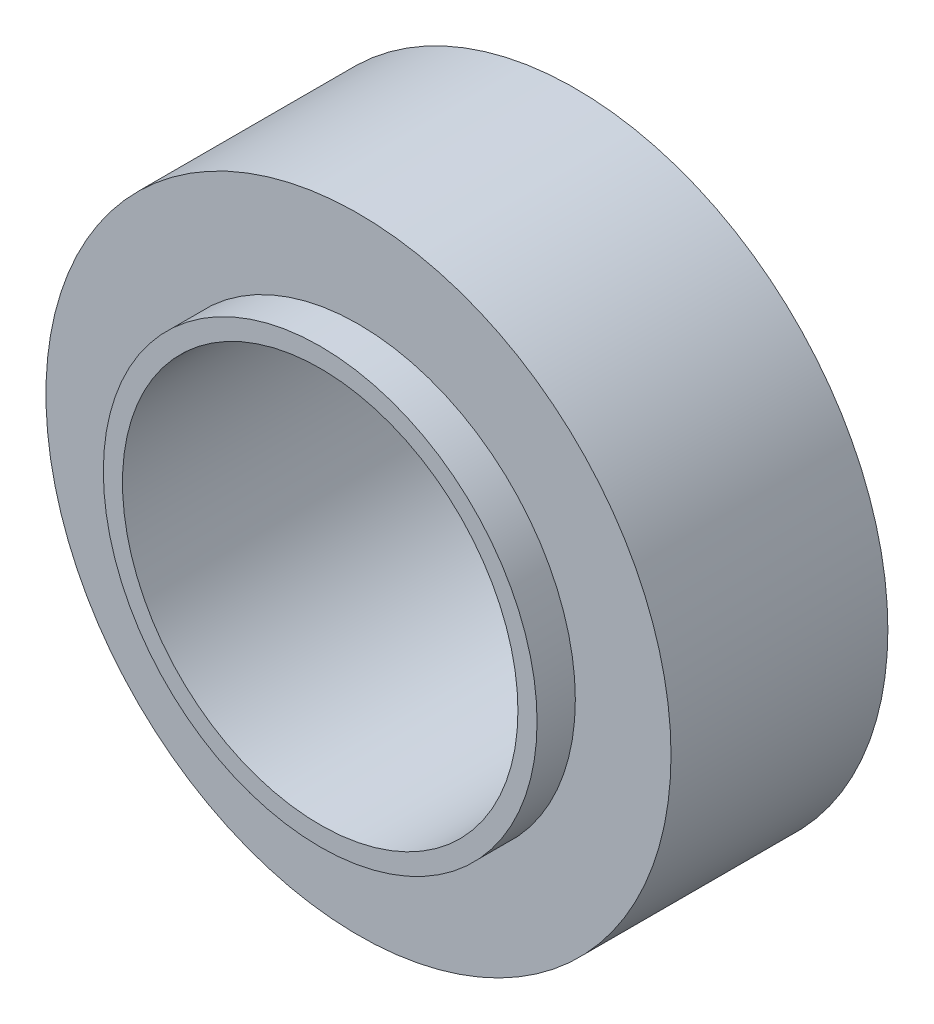
ISO-10303-21;
HEADER;
FILE_DESCRIPTION(('STEP AP214'),'2;1');
FILE_NAME('part.step','',(''),(''),'','','');
FILE_SCHEMA(('AUTOMOTIVE_DESIGN { 1 0 10303 214 1 1 1 1 }'));
ENDSEC;
DATA;
#1=APPLICATION_CONTEXT('core data for automotive mechanical design processes');
#2=APPLICATION_PROTOCOL_DEFINITION('international standard','automotive_design',2000,#1);
#3=PRODUCT_CONTEXT('',#1,'mechanical');
#4=PRODUCT('Part','Part','',(#3));
#5=PRODUCT_RELATED_PRODUCT_CATEGORY('part','',(#4));
#6=PRODUCT_DEFINITION_FORMATION('','',#4);
#7=PRODUCT_DEFINITION_CONTEXT('part definition',#1,'design');
#8=PRODUCT_DEFINITION('design','',#6,#7);
#9=PRODUCT_DEFINITION_SHAPE('','',#8);
#10=(LENGTH_UNIT() NAMED_UNIT(*) SI_UNIT(.MILLI.,.METRE.));
#11=(NAMED_UNIT(*) PLANE_ANGLE_UNIT() SI_UNIT($,.RADIAN.));
#12=(NAMED_UNIT(*) SI_UNIT($,.STERADIAN.) SOLID_ANGLE_UNIT());
#13=UNCERTAINTY_MEASURE_WITH_UNIT(LENGTH_MEASURE(1.E-05),#10,'distance_accuracy_value','');
#14=(GEOMETRIC_REPRESENTATION_CONTEXT(3) GLOBAL_UNCERTAINTY_ASSIGNED_CONTEXT((#13)) GLOBAL_UNIT_ASSIGNED_CONTEXT((#10,
#11,#12)) REPRESENTATION_CONTEXT('',''));
#15=CARTESIAN_POINT('',(0.,0.,0.));
#16=DIRECTION('',(0.,0.,1.));
#17=DIRECTION('',(1.,0.,0.));
#18=AXIS2_PLACEMENT_3D('',#15,#16,#17);
#19=CARTESIAN_POINT('',(0.,0.,23.));
#20=DIRECTION('',(0.,0.,1.));
#21=DIRECTION('',(1.,0.,0.));
#22=AXIS2_PLACEMENT_3D('',#19,#20,#21);
#23=PLANE('',#22);
#24=CARTESIAN_POINT('',(0.,0.,23.));
#25=DIRECTION('',(0.,0.,1.));
#26=DIRECTION('',(1.,0.,0.));
#27=AXIS2_PLACEMENT_3D('',#24,#25,#26);
#28=CIRCLE('',#27,34.);
#29=CARTESIAN_POINT('',(34.,0.,23.));
#30=VERTEX_POINT('',#29);
#31=EDGE_CURVE('E56',#30,#30,#28,.T.);
#32=ORIENTED_EDGE('',*,*,#31,.T.);
#33=EDGE_LOOP('',(#32));
#34=FACE_BOUND('',#33,.T.);
#35=CARTESIAN_POINT('',(0.,0.,23.));
#36=DIRECTION('',(0.,0.,1.));
#37=DIRECTION('',(1.,0.,0.));
#38=AXIS2_PLACEMENT_3D('',#35,#36,#37);
#39=CIRCLE('',#38,31.);
#40=CARTESIAN_POINT('',(31.,0.,23.));
#41=VERTEX_POINT('',#40);
#42=EDGE_CURVE('E10',#41,#41,#39,.T.);
#43=ORIENTED_EDGE('',*,*,#42,.F.);
#44=EDGE_LOOP('',(#43));
#45=FACE_BOUND('',#44,.T.);
#46=ADVANCED_FACE('F29',(#34,#45),#23,.T.);
#47=CARTESIAN_POINT('',(0.,0.,-23.));
#48=DIRECTION('',(0.,0.,1.));
#49=DIRECTION('',(1.,0.,0.));
#50=AXIS2_PLACEMENT_3D('',#47,#48,#49);
#51=PLANE('',#50);
#52=CARTESIAN_POINT('',(0.,0.,-23.));
#53=DIRECTION('',(0.,0.,1.));
#54=DIRECTION('',(1.,0.,0.));
#55=AXIS2_PLACEMENT_3D('',#52,#53,#54);
#56=CIRCLE('',#55,34.);
#57=CARTESIAN_POINT('',(34.,0.,-23.));
#58=VERTEX_POINT('',#57);
#59=EDGE_CURVE('E47',#58,#58,#56,.T.);
#60=ORIENTED_EDGE('',*,*,#59,.F.);
#61=EDGE_LOOP('',(#60));
#62=FACE_BOUND('',#61,.T.);
#63=CARTESIAN_POINT('',(0.,0.,-23.));
#64=DIRECTION('',(0.,0.,1.));
#65=DIRECTION('',(1.,0.,0.));
#66=AXIS2_PLACEMENT_3D('',#63,#64,#65);
#67=CIRCLE('',#66,31.);
#68=CARTESIAN_POINT('',(31.,0.,-23.));
#69=VERTEX_POINT('',#68);
#70=EDGE_CURVE('E33',#69,#69,#67,.T.);
#71=ORIENTED_EDGE('',*,*,#70,.T.);
#72=EDGE_LOOP('',(#71));
#73=FACE_BOUND('',#72,.T.);
#74=ADVANCED_FACE('F78',(#62,#73),#51,.F.);
#75=CARTESIAN_POINT('',(0.,0.,23.));
#76=DIRECTION('',(0.,0.,-1.));
#77=DIRECTION('',(-1.,0.,0.));
#78=AXIS2_PLACEMENT_3D('',#75,#76,#77);
#79=CYLINDRICAL_SURFACE('',#78,49.);
#80=CARTESIAN_POINT('',(0.,0.,17.));
#81=DIRECTION('',(0.,0.,1.));
#82=DIRECTION('',(1.,0.,0.));
#83=AXIS2_PLACEMENT_3D('',#80,#81,#82);
#84=CIRCLE('',#83,49.);
#85=CARTESIAN_POINT('',(49.,0.,17.));
#86=VERTEX_POINT('',#85);
#87=EDGE_CURVE('E50',#86,#86,#84,.T.);
#88=ORIENTED_EDGE('',*,*,#87,.F.);
#89=EDGE_LOOP('',(#88));
#90=FACE_BOUND('',#89,.T.);
#91=CARTESIAN_POINT('',(0.,0.,-17.));
#92=DIRECTION('',(0.,0.,1.));
#93=DIRECTION('',(1.,0.,0.));
#94=AXIS2_PLACEMENT_3D('',#91,#92,#93);
#95=CIRCLE('',#94,49.);
#96=CARTESIAN_POINT('',(49.,0.,-17.));
#97=VERTEX_POINT('',#96);
#98=EDGE_CURVE('E40',#97,#97,#95,.T.);
#99=ORIENTED_EDGE('',*,*,#98,.T.);
#100=EDGE_LOOP('',(#99));
#101=FACE_BOUND('',#100,.T.);
#102=ADVANCED_FACE('F31',(#90,#101),#79,.T.);
#103=CARTESIAN_POINT('',(0.,0.,23.));
#104=DIRECTION('',(0.,0.,-1.));
#105=DIRECTION('',(-1.,0.,0.));
#106=AXIS2_PLACEMENT_3D('',#103,#104,#105);
#107=CYLINDRICAL_SURFACE('',#106,31.);
#108=ORIENTED_EDGE('',*,*,#42,.T.);
#109=EDGE_LOOP('',(#108));
#110=FACE_BOUND('',#109,.T.);
#111=ORIENTED_EDGE('',*,*,#70,.F.);
#112=EDGE_LOOP('',(#111));
#113=FACE_BOUND('',#112,.T.);
#114=ADVANCED_FACE('F77',(#110,#113),#107,.F.);
#115=CARTESIAN_POINT('',(49.,0.,-17.));
#116=DIRECTION('',(0.,0.,1.));
#117=DIRECTION('',(1.,0.,0.));
#118=AXIS2_PLACEMENT_3D('',#115,#116,#117);
#119=PLANE('',#118);
#120=ORIENTED_EDGE('',*,*,#98,.F.);
#121=EDGE_LOOP('',(#120));
#122=FACE_BOUND('',#121,.T.);
#123=CARTESIAN_POINT('',(0.,0.,-17.));
#124=DIRECTION('',(0.,0.,1.));
#125=DIRECTION('',(1.,0.,0.));
#126=AXIS2_PLACEMENT_3D('',#123,#124,#125);
#127=CIRCLE('',#126,34.);
#128=CARTESIAN_POINT('',(34.,0.,-17.));
#129=VERTEX_POINT('',#128);
#130=EDGE_CURVE('E44',#129,#129,#127,.T.);
#131=ORIENTED_EDGE('',*,*,#130,.T.);
#132=EDGE_LOOP('',(#131));
#133=FACE_BOUND('',#132,.T.);
#134=ADVANCED_FACE('F81',(#122,#133),#119,.F.);
#135=CARTESIAN_POINT('',(0.,0.,23.));
#136=DIRECTION('',(0.,0.,1.));
#137=DIRECTION('',(1.,0.,0.));
#138=AXIS2_PLACEMENT_3D('',#135,#136,#137);
#139=CYLINDRICAL_SURFACE('',#138,34.);
#140=ORIENTED_EDGE('',*,*,#130,.F.);
#141=EDGE_LOOP('',(#140));
#142=FACE_BOUND('',#141,.T.);
#143=ORIENTED_EDGE('',*,*,#59,.T.);
#144=EDGE_LOOP('',(#143));
#145=FACE_BOUND('',#144,.T.);
#146=ADVANCED_FACE('F71',(#142,#145),#139,.T.);
#147=CARTESIAN_POINT('',(49.,0.,17.));
#148=DIRECTION('',(0.,0.,-1.));
#149=DIRECTION('',(-1.,0.,0.));
#150=AXIS2_PLACEMENT_3D('',#147,#148,#149);
#151=PLANE('',#150);
#152=CARTESIAN_POINT('',(0.,0.,17.));
#153=DIRECTION('',(0.,0.,1.));
#154=DIRECTION('',(1.,0.,0.));
#155=AXIS2_PLACEMENT_3D('',#152,#153,#154);
#156=CIRCLE('',#155,34.);
#157=CARTESIAN_POINT('',(34.,0.,17.));
#158=VERTEX_POINT('',#157);
#159=EDGE_CURVE('E53',#158,#158,#156,.T.);
#160=ORIENTED_EDGE('',*,*,#159,.F.);
#161=EDGE_LOOP('',(#160));
#162=FACE_BOUND('',#161,.T.);
#163=ORIENTED_EDGE('',*,*,#87,.T.);
#164=EDGE_LOOP('',(#163));
#165=FACE_BOUND('',#164,.T.);
#166=ADVANCED_FACE('F65',(#162,#165),#151,.F.);
#167=CARTESIAN_POINT('',(0.,0.,23.));
#168=DIRECTION('',(0.,0.,1.));
#169=DIRECTION('',(1.,0.,0.));
#170=AXIS2_PLACEMENT_3D('',#167,#168,#169);
#171=CYLINDRICAL_SURFACE('',#170,34.);
#172=ORIENTED_EDGE('',*,*,#31,.F.);
#173=EDGE_LOOP('',(#172));
#174=FACE_BOUND('',#173,.T.);
#175=ORIENTED_EDGE('',*,*,#159,.T.);
#176=EDGE_LOOP('',(#175));
#177=FACE_BOUND('',#176,.T.);
#178=ADVANCED_FACE('F62',(#174,#177),#171,.T.);
#179=CLOSED_SHELL('',(#46,#74,#102,#114,#134,#146,#166,#178));
#180=MANIFOLD_SOLID_BREP('B2',#179);
#181=ADVANCED_BREP_SHAPE_REPRESENTATION('',(#18,#180),#14);
#182=SHAPE_DEFINITION_REPRESENTATION(#9,#181);
ENDSEC;
END-ISO-10303-21;
